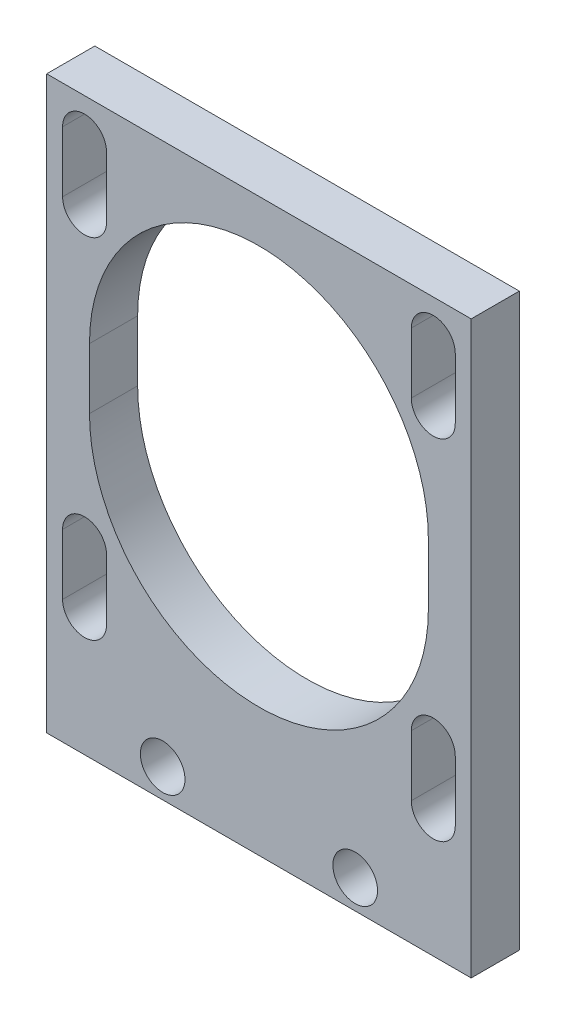
ISO-10303-21;
HEADER;
FILE_DESCRIPTION(('STEP AP214'),'2;1');
FILE_NAME('part.step','',(''),(''),'','','');
FILE_SCHEMA(('AUTOMOTIVE_DESIGN { 1 0 10303 214 1 1 1 1 }'));
ENDSEC;
DATA;
#1=APPLICATION_CONTEXT('core data for automotive mechanical design processes');
#2=APPLICATION_PROTOCOL_DEFINITION('international standard','automotive_design',2000,#1);
#3=PRODUCT_CONTEXT('',#1,'mechanical');
#4=PRODUCT('Part','Part','',(#3));
#5=PRODUCT_RELATED_PRODUCT_CATEGORY('part','',(#4));
#6=PRODUCT_DEFINITION_FORMATION('','',#4);
#7=PRODUCT_DEFINITION_CONTEXT('part definition',#1,'design');
#8=PRODUCT_DEFINITION('design','',#6,#7);
#9=PRODUCT_DEFINITION_SHAPE('','',#8);
#10=(LENGTH_UNIT() NAMED_UNIT(*) SI_UNIT(.MILLI.,.METRE.));
#11=(NAMED_UNIT(*) PLANE_ANGLE_UNIT() SI_UNIT($,.RADIAN.));
#12=(NAMED_UNIT(*) SI_UNIT($,.STERADIAN.) SOLID_ANGLE_UNIT());
#13=UNCERTAINTY_MEASURE_WITH_UNIT(LENGTH_MEASURE(1.E-05),#10,'distance_accuracy_value','');
#14=(GEOMETRIC_REPRESENTATION_CONTEXT(3) GLOBAL_UNCERTAINTY_ASSIGNED_CONTEXT((#13)) GLOBAL_UNIT_ASSIGNED_CONTEXT((#10,
#11,#12)) REPRESENTATION_CONTEXT('',''));
#15=CARTESIAN_POINT('',(0.,0.,0.));
#16=DIRECTION('',(0.,0.,1.));
#17=DIRECTION('',(1.,0.,0.));
#18=AXIS2_PLACEMENT_3D('',#15,#16,#17);
#19=CARTESIAN_POINT('',(13.99999994,-14.,3.175));
#20=DIRECTION('',(-1.,0.,0.));
#21=DIRECTION('',(0.,0.,1.));
#22=AXIS2_PLACEMENT_3D('',#19,#20,#21);
#23=PLANE('',#22);
#24=DIRECTION('',(0.,1.,0.));
#25=VECTOR('',#24,1.);
#26=CARTESIAN_POINT('',(13.99999994,-14.,3.175));
#27=LINE('',#26,#25);
#28=CARTESIAN_POINT('',(13.99999994,14.448,3.175));
#29=VERTEX_POINT('',#28);
#30=CARTESIAN_POINT('',(13.99999994,52.1,3.175));
#31=VERTEX_POINT('',#30);
#32=EDGE_CURVE('E43',#29,#31,#27,.T.);
#33=ORIENTED_EDGE('',*,*,#32,.F.);
#34=DIRECTION('',(0.,0.,-1.));
#35=VECTOR('',#34,1.);
#36=CARTESIAN_POINT('',(13.99999994,14.448,3.175));
#37=LINE('',#36,#35);
#38=CARTESIAN_POINT('',(13.99999994,14.448,0.));
#39=VERTEX_POINT('',#38);
#40=EDGE_CURVE('E198',#29,#39,#37,.T.);
#41=ORIENTED_EDGE('',*,*,#40,.T.);
#42=DIRECTION('',(0.,1.,0.));
#43=VECTOR('',#42,1.);
#44=CARTESIAN_POINT('',(13.99999994,-14.,0.));
#45=LINE('',#44,#43);
#46=CARTESIAN_POINT('',(13.99999994,52.1,0.));
#47=VERTEX_POINT('',#46);
#48=EDGE_CURVE('E233',#39,#47,#45,.T.);
#49=ORIENTED_EDGE('',*,*,#48,.T.);
#50=DIRECTION('',(0.,0.,-1.));
#51=VECTOR('',#50,1.);
#52=CARTESIAN_POINT('',(13.99999994,52.1,0.));
#53=LINE('',#52,#51);
#54=EDGE_CURVE('E216',#31,#47,#53,.T.);
#55=ORIENTED_EDGE('',*,*,#54,.F.);
#56=EDGE_LOOP('',(#33,#41,#49,#55));
#57=FACE_BOUND('',#56,.T.);
#58=ADVANCED_FACE('F35',(#57),#23,.F.);
#59=CARTESIAN_POINT('',(-13.99999994,-14.,3.175));
#60=DIRECTION('',(1.,0.,0.));
#61=DIRECTION('',(0.,0.,-1.));
#62=AXIS2_PLACEMENT_3D('',#59,#60,#61);
#63=PLANE('',#62);
#64=DIRECTION('',(0.,-1.,0.));
#65=VECTOR('',#64,1.);
#66=CARTESIAN_POINT('',(-13.99999994,-14.,0.));
#67=LINE('',#66,#65);
#68=CARTESIAN_POINT('',(-13.99999994,52.1,0.));
#69=VERTEX_POINT('',#68);
#70=CARTESIAN_POINT('',(-13.99999994,14.448,0.));
#71=VERTEX_POINT('',#70);
#72=EDGE_CURVE('E38',#69,#71,#67,.T.);
#73=ORIENTED_EDGE('',*,*,#72,.T.);
#74=DIRECTION('',(0.,0.,-1.));
#75=VECTOR('',#74,1.);
#76=CARTESIAN_POINT('',(-13.99999994,14.448,3.175));
#77=LINE('',#76,#75);
#78=CARTESIAN_POINT('',(-13.99999994,14.448,3.175));
#79=VERTEX_POINT('',#78);
#80=EDGE_CURVE('E51',#79,#71,#77,.T.);
#81=ORIENTED_EDGE('',*,*,#80,.F.);
#82=DIRECTION('',(0.,-1.,0.));
#83=VECTOR('',#82,1.);
#84=CARTESIAN_POINT('',(-13.99999994,-14.,3.175));
#85=LINE('',#84,#83);
#86=CARTESIAN_POINT('',(-13.99999994,52.1,3.175));
#87=VERTEX_POINT('',#86);
#88=EDGE_CURVE('E11',#87,#79,#85,.T.);
#89=ORIENTED_EDGE('',*,*,#88,.F.);
#90=DIRECTION('',(0.,0.,1.));
#91=VECTOR('',#90,1.);
#92=CARTESIAN_POINT('',(-13.99999994,52.1,0.));
#93=LINE('',#92,#91);
#94=EDGE_CURVE('E217',#69,#87,#93,.T.);
#95=ORIENTED_EDGE('',*,*,#94,.F.);
#96=EDGE_LOOP('',(#73,#81,#89,#95));
#97=FACE_BOUND('',#96,.T.);
#98=ADVANCED_FACE('F205',(#97),#63,.F.);
#99=CARTESIAN_POINT('',(13.99999994,14.,3.175));
#100=DIRECTION('',(0.,0.,-1.));
#101=DIRECTION('',(-1.,0.,0.));
#102=AXIS2_PLACEMENT_3D('',#99,#100,#101);
#103=PLANE('',#102);
#104=CARTESIAN_POINT('',(6.34999999999997,16.3457722435057,3.175));
#105=DIRECTION('',(0.,0.,-1.));
#106=DIRECTION('',(-1.,0.,0.));
#107=AXIS2_PLACEMENT_3D('',#104,#105,#106);
#108=CIRCLE('',#107,1.4732);
#109=CARTESIAN_POINT('',(4.87679999999998,16.3457722435057,3.175));
#110=VERTEX_POINT('',#109);
#111=EDGE_CURVE('E245',#110,#110,#108,.T.);
#112=ORIENTED_EDGE('',*,*,#111,.T.);
#113=EDGE_LOOP('',(#112));
#114=FACE_BOUND('',#113,.T.);
#115=CARTESIAN_POINT('',(-6.34999999999993,16.3457722435058,3.175));
#116=DIRECTION('',(0.,0.,-1.));
#117=DIRECTION('',(-1.,0.,0.));
#118=AXIS2_PLACEMENT_3D('',#115,#116,#117);
#119=CIRCLE('',#118,1.4732);
#120=CARTESIAN_POINT('',(-7.82319999999993,16.3457722435058,3.175));
#121=VERTEX_POINT('',#120);
#122=EDGE_CURVE('E251',#121,#121,#119,.T.);
#123=ORIENTED_EDGE('',*,*,#122,.T.);
#124=EDGE_LOOP('',(#123));
#125=FACE_BOUND('',#124,.T.);
#126=DIRECTION('',(0.,-1.,0.));
#127=VECTOR('',#126,1.);
#128=CARTESIAN_POINT('',(11.176,34.1,3.175));
#129=LINE('',#128,#127);
#130=CARTESIAN_POINT('',(11.176,38.1,3.175));
#131=VERTEX_POINT('',#130);
#132=CARTESIAN_POINT('',(11.176,34.1,3.175));
#133=VERTEX_POINT('',#132);
#134=EDGE_CURVE('E263',#131,#133,#129,.T.);
#135=ORIENTED_EDGE('',*,*,#134,.T.);
#136=CARTESIAN_POINT('',(0.,34.1,3.175));
#137=DIRECTION('',(0.,0.,-1.));
#138=DIRECTION('',(-1.,0.,0.));
#139=AXIS2_PLACEMENT_3D('',#136,#137,#138);
#140=CIRCLE('',#139,11.176);
#141=CARTESIAN_POINT('',(-11.176,34.1,3.175));
#142=VERTEX_POINT('',#141);
#143=EDGE_CURVE('E255',#133,#142,#140,.T.);
#144=ORIENTED_EDGE('',*,*,#143,.T.);
#145=DIRECTION('',(0.,1.,0.));
#146=VECTOR('',#145,1.);
#147=CARTESIAN_POINT('',(-11.176,34.1,3.175));
#148=LINE('',#147,#146);
#149=CARTESIAN_POINT('',(-11.176,38.1,3.175));
#150=VERTEX_POINT('',#149);
#151=EDGE_CURVE('E258',#142,#150,#148,.T.);
#152=ORIENTED_EDGE('',*,*,#151,.T.);
#153=CARTESIAN_POINT('',(0.,38.1,3.175));
#154=DIRECTION('',(0.,0.,-1.));
#155=DIRECTION('',(-1.,0.,0.));
#156=AXIS2_PLACEMENT_3D('',#153,#154,#155);
#157=CIRCLE('',#156,11.176);
#158=EDGE_CURVE('E59',#150,#131,#157,.T.);
#159=ORIENTED_EDGE('',*,*,#158,.T.);
#160=EDGE_LOOP('',(#135,#144,#152,#159));
#161=FACE_BOUND('',#160,.T.);
#162=DIRECTION('',(0.,-1.,0.));
#163=VECTOR('',#162,1.);
#164=CARTESIAN_POINT('',(-10.05000006,22.6,3.175));
#165=LINE('',#164,#163);
#166=CARTESIAN_POINT('',(-10.05000006,26.6,3.175));
#167=VERTEX_POINT('',#166);
#168=CARTESIAN_POINT('',(-10.05000006,22.6,3.175));
#169=VERTEX_POINT('',#168);
#170=EDGE_CURVE('E295',#167,#169,#165,.T.);
#171=ORIENTED_EDGE('',*,*,#170,.T.);
#172=CARTESIAN_POINT('',(-11.50000006,22.6,3.175));
#173=DIRECTION('',(0.,0.,-1.));
#174=DIRECTION('',(-1.,0.,0.));
#175=AXIS2_PLACEMENT_3D('',#172,#173,#174);
#176=CIRCLE('',#175,1.45);
#177=CARTESIAN_POINT('',(-12.95000006,22.6,3.175));
#178=VERTEX_POINT('',#177);
#179=EDGE_CURVE('E285',#169,#178,#176,.T.);
#180=ORIENTED_EDGE('',*,*,#179,.T.);
#181=DIRECTION('',(0.,1.,0.));
#182=VECTOR('',#181,1.);
#183=CARTESIAN_POINT('',(-12.95000006,22.6,3.175));
#184=LINE('',#183,#182);
#185=CARTESIAN_POINT('',(-12.95000006,26.6,3.175));
#186=VERTEX_POINT('',#185);
#187=EDGE_CURVE('E288',#178,#186,#184,.T.);
#188=ORIENTED_EDGE('',*,*,#187,.T.);
#189=CARTESIAN_POINT('',(-11.5000000600002,26.6,3.175));
#190=DIRECTION('',(0.,0.,-1.));
#191=DIRECTION('',(-1.,0.,0.));
#192=AXIS2_PLACEMENT_3D('',#189,#190,#191);
#193=CIRCLE('',#192,1.45);
#194=EDGE_CURVE('E292',#186,#167,#193,.T.);
#195=ORIENTED_EDGE('',*,*,#194,.T.);
#196=EDGE_LOOP('',(#171,#180,#188,#195));
#197=FACE_BOUND('',#196,.T.);
#198=DIRECTION('',(0.,-1.,0.));
#199=VECTOR('',#198,1.);
#200=CARTESIAN_POINT('',(12.94999994,22.6,3.175));
#201=LINE('',#200,#199);
#202=CARTESIAN_POINT('',(12.94999994,26.6,3.175));
#203=VERTEX_POINT('',#202);
#204=CARTESIAN_POINT('',(12.94999994,22.6,3.175));
#205=VERTEX_POINT('',#204);
#206=EDGE_CURVE('E327',#203,#205,#201,.T.);
#207=ORIENTED_EDGE('',*,*,#206,.T.);
#208=CARTESIAN_POINT('',(11.49999994,22.6,3.175));
#209=DIRECTION('',(0.,0.,-1.));
#210=DIRECTION('',(-1.,0.,0.));
#211=AXIS2_PLACEMENT_3D('',#208,#209,#210);
#212=CIRCLE('',#211,1.45);
#213=CARTESIAN_POINT('',(10.04999994,22.6,3.175));
#214=VERTEX_POINT('',#213);
#215=EDGE_CURVE('E317',#205,#214,#212,.T.);
#216=ORIENTED_EDGE('',*,*,#215,.T.);
#217=DIRECTION('',(0.,1.,0.));
#218=VECTOR('',#217,1.);
#219=CARTESIAN_POINT('',(10.04999994,22.6,3.175));
#220=LINE('',#219,#218);
#221=CARTESIAN_POINT('',(10.04999994,26.6,3.175));
#222=VERTEX_POINT('',#221);
#223=EDGE_CURVE('E320',#214,#222,#220,.T.);
#224=ORIENTED_EDGE('',*,*,#223,.T.);
#225=CARTESIAN_POINT('',(11.4999999399998,26.6,3.175));
#226=DIRECTION('',(0.,0.,-1.));
#227=DIRECTION('',(-1.,0.,0.));
#228=AXIS2_PLACEMENT_3D('',#225,#226,#227);
#229=CIRCLE('',#228,1.45);
#230=EDGE_CURVE('E324',#222,#203,#229,.T.);
#231=ORIENTED_EDGE('',*,*,#230,.T.);
#232=EDGE_LOOP('',(#207,#216,#224,#231));
#233=FACE_BOUND('',#232,.T.);
#234=DIRECTION('',(0.,-1.,0.));
#235=VECTOR('',#234,1.);
#236=CARTESIAN_POINT('',(-10.05000006,45.6,3.175));
#237=LINE('',#236,#235);
#238=CARTESIAN_POINT('',(-10.05000006,49.6,3.175));
#239=VERTEX_POINT('',#238);
#240=CARTESIAN_POINT('',(-10.05000006,45.6,3.175));
#241=VERTEX_POINT('',#240);
#242=EDGE_CURVE('E359',#239,#241,#237,.T.);
#243=ORIENTED_EDGE('',*,*,#242,.T.);
#244=CARTESIAN_POINT('',(-11.5000000599998,45.6,3.175));
#245=DIRECTION('',(0.,0.,-1.));
#246=DIRECTION('',(-1.,0.,0.));
#247=AXIS2_PLACEMENT_3D('',#244,#245,#246);
#248=CIRCLE('',#247,1.45);
#249=CARTESIAN_POINT('',(-12.95000006,45.6,3.175));
#250=VERTEX_POINT('',#249);
#251=EDGE_CURVE('E349',#241,#250,#248,.T.);
#252=ORIENTED_EDGE('',*,*,#251,.T.);
#253=DIRECTION('',(0.,1.,0.));
#254=VECTOR('',#253,1.);
#255=CARTESIAN_POINT('',(-12.95000006,45.6,3.175));
#256=LINE('',#255,#254);
#257=CARTESIAN_POINT('',(-12.95000006,49.6,3.175));
#258=VERTEX_POINT('',#257);
#259=EDGE_CURVE('E352',#250,#258,#256,.T.);
#260=ORIENTED_EDGE('',*,*,#259,.T.);
#261=CARTESIAN_POINT('',(-11.50000006,49.6,3.175));
#262=DIRECTION('',(0.,0.,-1.));
#263=DIRECTION('',(-1.,0.,0.));
#264=AXIS2_PLACEMENT_3D('',#261,#262,#263);
#265=CIRCLE('',#264,1.45);
#266=EDGE_CURVE('E356',#258,#239,#265,.T.);
#267=ORIENTED_EDGE('',*,*,#266,.T.);
#268=EDGE_LOOP('',(#243,#252,#260,#267));
#269=FACE_BOUND('',#268,.T.);
#270=DIRECTION('',(0.,-1.,0.));
#271=VECTOR('',#270,1.);
#272=CARTESIAN_POINT('',(12.94999994,45.6,3.175));
#273=LINE('',#272,#271);
#274=CARTESIAN_POINT('',(12.94999994,49.6,3.175));
#275=VERTEX_POINT('',#274);
#276=CARTESIAN_POINT('',(12.94999994,45.6,3.175));
#277=VERTEX_POINT('',#276);
#278=EDGE_CURVE('E391',#275,#277,#273,.T.);
#279=ORIENTED_EDGE('',*,*,#278,.T.);
#280=CARTESIAN_POINT('',(11.49999994,45.6,3.175));
#281=DIRECTION('',(0.,0.,-1.));
#282=DIRECTION('',(-1.,0.,0.));
#283=AXIS2_PLACEMENT_3D('',#280,#281,#282);
#284=CIRCLE('',#283,1.45);
#285=CARTESIAN_POINT('',(10.04999994,45.6,3.175));
#286=VERTEX_POINT('',#285);
#287=EDGE_CURVE('E381',#277,#286,#284,.T.);
#288=ORIENTED_EDGE('',*,*,#287,.T.);
#289=DIRECTION('',(0.,1.,0.));
#290=VECTOR('',#289,1.);
#291=CARTESIAN_POINT('',(10.04999994,45.6,3.175));
#292=LINE('',#291,#290);
#293=CARTESIAN_POINT('',(10.04999994,49.6,3.175));
#294=VERTEX_POINT('',#293);
#295=EDGE_CURVE('E384',#286,#294,#292,.T.);
#296=ORIENTED_EDGE('',*,*,#295,.T.);
#297=CARTESIAN_POINT('',(11.49999994,49.6,3.175));
#298=DIRECTION('',(0.,0.,-1.));
#299=DIRECTION('',(-1.,0.,0.));
#300=AXIS2_PLACEMENT_3D('',#297,#298,#299);
#301=CIRCLE('',#300,1.45);
#302=EDGE_CURVE('E388',#294,#275,#301,.T.);
#303=ORIENTED_EDGE('',*,*,#302,.T.);
#304=EDGE_LOOP('',(#279,#288,#296,#303));
#305=FACE_BOUND('',#304,.T.);
#306=ORIENTED_EDGE('',*,*,#88,.T.);
#307=DIRECTION('',(1.,0.,0.));
#308=VECTOR('',#307,1.);
#309=CARTESIAN_POINT('',(13.99999994,14.448,3.175));
#310=LINE('',#309,#308);
#311=EDGE_CURVE('E195',#79,#29,#310,.T.);
#312=ORIENTED_EDGE('',*,*,#311,.T.);
#313=ORIENTED_EDGE('',*,*,#32,.T.);
#314=DIRECTION('',(1.,0.,0.));
#315=VECTOR('',#314,1.);
#316=CARTESIAN_POINT('',(-13.99999994,52.1,3.175));
#317=LINE('',#316,#315);
#318=EDGE_CURVE('E211',#87,#31,#317,.T.);
#319=ORIENTED_EDGE('',*,*,#318,.F.);
#320=EDGE_LOOP('',(#306,#312,#313,#319));
#321=FACE_BOUND('',#320,.T.);
#322=ADVANCED_FACE('F209',(#114,#125,#161,#197,#233,#269,#305,#321),#103,.F.);
#323=CARTESIAN_POINT('',(13.99999994,14.,0.));
#324=DIRECTION('',(0.,0.,-1.));
#325=DIRECTION('',(-1.,0.,0.));
#326=AXIS2_PLACEMENT_3D('',#323,#324,#325);
#327=PLANE('',#326);
#328=DIRECTION('',(1.,0.,0.));
#329=VECTOR('',#328,1.);
#330=CARTESIAN_POINT('',(13.99999994,14.448,0.));
#331=LINE('',#330,#329);
#332=EDGE_CURVE('E201',#71,#39,#331,.T.);
#333=ORIENTED_EDGE('',*,*,#332,.F.);
#334=ORIENTED_EDGE('',*,*,#72,.F.);
#335=DIRECTION('',(-1.,0.,0.));
#336=VECTOR('',#335,1.);
#337=CARTESIAN_POINT('',(-13.99999994,52.1,0.));
#338=LINE('',#337,#336);
#339=EDGE_CURVE('E222',#47,#69,#338,.T.);
#340=ORIENTED_EDGE('',*,*,#339,.F.);
#341=ORIENTED_EDGE('',*,*,#48,.F.);
#342=EDGE_LOOP('',(#333,#334,#340,#341));
#343=FACE_BOUND('',#342,.T.);
#344=CARTESIAN_POINT('',(6.34999999999997,16.3457722435057,0.));
#345=DIRECTION('',(0.,0.,-1.));
#346=DIRECTION('',(-1.,0.,0.));
#347=AXIS2_PLACEMENT_3D('',#344,#345,#346);
#348=CIRCLE('',#347,1.4732);
#349=CARTESIAN_POINT('',(4.87679999999998,16.3457722435057,0.));
#350=VERTEX_POINT('',#349);
#351=EDGE_CURVE('E241',#350,#350,#348,.T.);
#352=ORIENTED_EDGE('',*,*,#351,.F.);
#353=EDGE_LOOP('',(#352));
#354=FACE_BOUND('',#353,.T.);
#355=CARTESIAN_POINT('',(-6.34999999999993,16.3457722435058,0.));
#356=DIRECTION('',(0.,0.,-1.));
#357=DIRECTION('',(-1.,0.,0.));
#358=AXIS2_PLACEMENT_3D('',#355,#356,#357);
#359=CIRCLE('',#358,1.4732);
#360=CARTESIAN_POINT('',(-7.82319999999993,16.3457722435058,0.));
#361=VERTEX_POINT('',#360);
#362=EDGE_CURVE('E248',#361,#361,#359,.T.);
#363=ORIENTED_EDGE('',*,*,#362,.F.);
#364=EDGE_LOOP('',(#363));
#365=FACE_BOUND('',#364,.T.);
#366=CARTESIAN_POINT('',(0.,34.1,0.));
#367=DIRECTION('',(0.,0.,-1.));
#368=DIRECTION('',(-1.,0.,0.));
#369=AXIS2_PLACEMENT_3D('',#366,#367,#368);
#370=CIRCLE('',#369,11.176);
#371=CARTESIAN_POINT('',(11.176,34.1,0.));
#372=VERTEX_POINT('',#371);
#373=CARTESIAN_POINT('',(-11.176,34.1,0.));
#374=VERTEX_POINT('',#373);
#375=EDGE_CURVE('E254',#372,#374,#370,.T.);
#376=ORIENTED_EDGE('',*,*,#375,.F.);
#377=DIRECTION('',(0.,-1.,0.));
#378=VECTOR('',#377,1.);
#379=CARTESIAN_POINT('',(11.176,34.1,0.));
#380=LINE('',#379,#378);
#381=CARTESIAN_POINT('',(11.176,38.1,0.));
#382=VERTEX_POINT('',#381);
#383=EDGE_CURVE('E259',#382,#372,#380,.T.);
#384=ORIENTED_EDGE('',*,*,#383,.F.);
#385=CARTESIAN_POINT('',(0.,38.1,0.));
#386=DIRECTION('',(0.,0.,-1.));
#387=DIRECTION('',(-1.,0.,0.));
#388=AXIS2_PLACEMENT_3D('',#385,#386,#387);
#389=CIRCLE('',#388,11.176);
#390=CARTESIAN_POINT('',(-11.176,38.1,0.));
#391=VERTEX_POINT('',#390);
#392=EDGE_CURVE('E271',#391,#382,#389,.T.);
#393=ORIENTED_EDGE('',*,*,#392,.F.);
#394=DIRECTION('',(0.,1.,0.));
#395=VECTOR('',#394,1.);
#396=CARTESIAN_POINT('',(-11.176,34.1,0.));
#397=LINE('',#396,#395);
#398=EDGE_CURVE('E268',#374,#391,#397,.T.);
#399=ORIENTED_EDGE('',*,*,#398,.F.);
#400=EDGE_LOOP('',(#376,#384,#393,#399));
#401=FACE_BOUND('',#400,.T.);
#402=CARTESIAN_POINT('',(-11.50000006,22.6,0.));
#403=DIRECTION('',(0.,0.,-1.));
#404=DIRECTION('',(-1.,0.,0.));
#405=AXIS2_PLACEMENT_3D('',#402,#403,#404);
#406=CIRCLE('',#405,1.45);
#407=CARTESIAN_POINT('',(-10.05000006,22.6,0.));
#408=VERTEX_POINT('',#407);
#409=CARTESIAN_POINT('',(-12.95000006,22.6,0.));
#410=VERTEX_POINT('',#409);
#411=EDGE_CURVE('E278',#408,#410,#406,.T.);
#412=ORIENTED_EDGE('',*,*,#411,.F.);
#413=DIRECTION('',(0.,-1.,0.));
#414=VECTOR('',#413,1.);
#415=CARTESIAN_POINT('',(-10.05000006,22.6,0.));
#416=LINE('',#415,#414);
#417=CARTESIAN_POINT('',(-10.05000006,26.6,0.));
#418=VERTEX_POINT('',#417);
#419=EDGE_CURVE('E289',#418,#408,#416,.T.);
#420=ORIENTED_EDGE('',*,*,#419,.F.);
#421=CARTESIAN_POINT('',(-11.5000000600002,26.6,0.));
#422=DIRECTION('',(0.,0.,-1.));
#423=DIRECTION('',(-1.,0.,0.));
#424=AXIS2_PLACEMENT_3D('',#421,#422,#423);
#425=CIRCLE('',#424,1.45);
#426=CARTESIAN_POINT('',(-12.9500000600002,26.6,0.));
#427=VERTEX_POINT('',#426);
#428=EDGE_CURVE('E303',#427,#418,#425,.T.);
#429=ORIENTED_EDGE('',*,*,#428,.F.);
#430=DIRECTION('',(0.,1.,0.));
#431=VECTOR('',#430,1.);
#432=CARTESIAN_POINT('',(-12.95000006,22.6,0.));
#433=LINE('',#432,#431);
#434=EDGE_CURVE('E300',#410,#427,#433,.T.);
#435=ORIENTED_EDGE('',*,*,#434,.F.);
#436=EDGE_LOOP('',(#412,#420,#429,#435));
#437=FACE_BOUND('',#436,.T.);
#438=CARTESIAN_POINT('',(11.49999994,22.6,0.));
#439=DIRECTION('',(0.,0.,-1.));
#440=DIRECTION('',(-1.,0.,0.));
#441=AXIS2_PLACEMENT_3D('',#438,#439,#440);
#442=CIRCLE('',#441,1.45);
#443=CARTESIAN_POINT('',(12.94999994,22.6,0.));
#444=VERTEX_POINT('',#443);
#445=CARTESIAN_POINT('',(10.04999994,22.6,0.));
#446=VERTEX_POINT('',#445);
#447=EDGE_CURVE('E310',#444,#446,#442,.T.);
#448=ORIENTED_EDGE('',*,*,#447,.F.);
#449=DIRECTION('',(0.,-1.,0.));
#450=VECTOR('',#449,1.);
#451=CARTESIAN_POINT('',(12.94999994,22.6,0.));
#452=LINE('',#451,#450);
#453=CARTESIAN_POINT('',(12.94999994,26.6,0.));
#454=VERTEX_POINT('',#453);
#455=EDGE_CURVE('E321',#454,#444,#452,.T.);
#456=ORIENTED_EDGE('',*,*,#455,.F.);
#457=CARTESIAN_POINT('',(11.4999999399998,26.6,0.));
#458=DIRECTION('',(0.,0.,-1.));
#459=DIRECTION('',(-1.,0.,0.));
#460=AXIS2_PLACEMENT_3D('',#457,#458,#459);
#461=CIRCLE('',#460,1.45);
#462=CARTESIAN_POINT('',(10.0499999399998,26.6,0.));
#463=VERTEX_POINT('',#462);
#464=EDGE_CURVE('E335',#463,#454,#461,.T.);
#465=ORIENTED_EDGE('',*,*,#464,.F.);
#466=DIRECTION('',(0.,1.,0.));
#467=VECTOR('',#466,1.);
#468=CARTESIAN_POINT('',(10.04999994,22.6,0.));
#469=LINE('',#468,#467);
#470=EDGE_CURVE('E332',#446,#463,#469,.T.);
#471=ORIENTED_EDGE('',*,*,#470,.F.);
#472=EDGE_LOOP('',(#448,#456,#465,#471));
#473=FACE_BOUND('',#472,.T.);
#474=CARTESIAN_POINT('',(-11.5000000599998,45.6,0.));
#475=DIRECTION('',(0.,0.,-1.));
#476=DIRECTION('',(-1.,0.,0.));
#477=AXIS2_PLACEMENT_3D('',#474,#475,#476);
#478=CIRCLE('',#477,1.45);
#479=CARTESIAN_POINT('',(-10.05000006,45.6,0.));
#480=VERTEX_POINT('',#479);
#481=CARTESIAN_POINT('',(-12.95000006,45.6,0.));
#482=VERTEX_POINT('',#481);
#483=EDGE_CURVE('E342',#480,#482,#478,.T.);
#484=ORIENTED_EDGE('',*,*,#483,.F.);
#485=DIRECTION('',(0.,-1.,0.));
#486=VECTOR('',#485,1.);
#487=CARTESIAN_POINT('',(-10.05000006,45.6,0.));
#488=LINE('',#487,#486);
#489=CARTESIAN_POINT('',(-10.05000006,49.6,0.));
#490=VERTEX_POINT('',#489);
#491=EDGE_CURVE('E353',#490,#480,#488,.T.);
#492=ORIENTED_EDGE('',*,*,#491,.F.);
#493=CARTESIAN_POINT('',(-11.50000006,49.6,0.));
#494=DIRECTION('',(0.,0.,-1.));
#495=DIRECTION('',(-1.,0.,0.));
#496=AXIS2_PLACEMENT_3D('',#493,#494,#495);
#497=CIRCLE('',#496,1.45);
#498=CARTESIAN_POINT('',(-12.95000006,49.6,0.));
#499=VERTEX_POINT('',#498);
#500=EDGE_CURVE('E367',#499,#490,#497,.T.);
#501=ORIENTED_EDGE('',*,*,#500,.F.);
#502=DIRECTION('',(0.,1.,0.));
#503=VECTOR('',#502,1.);
#504=CARTESIAN_POINT('',(-12.95000006,45.6,0.));
#505=LINE('',#504,#503);
#506=EDGE_CURVE('E364',#482,#499,#505,.T.);
#507=ORIENTED_EDGE('',*,*,#506,.F.);
#508=EDGE_LOOP('',(#484,#492,#501,#507));
#509=FACE_BOUND('',#508,.T.);
#510=CARTESIAN_POINT('',(11.49999994,45.6,0.));
#511=DIRECTION('',(0.,0.,-1.));
#512=DIRECTION('',(-1.,0.,0.));
#513=AXIS2_PLACEMENT_3D('',#510,#511,#512);
#514=CIRCLE('',#513,1.45);
#515=CARTESIAN_POINT('',(12.94999994,45.6,0.));
#516=VERTEX_POINT('',#515);
#517=CARTESIAN_POINT('',(10.04999994,45.6,0.));
#518=VERTEX_POINT('',#517);
#519=EDGE_CURVE('E374',#516,#518,#514,.T.);
#520=ORIENTED_EDGE('',*,*,#519,.F.);
#521=DIRECTION('',(0.,-1.,0.));
#522=VECTOR('',#521,1.);
#523=CARTESIAN_POINT('',(12.94999994,45.6,0.));
#524=LINE('',#523,#522);
#525=CARTESIAN_POINT('',(12.94999994,49.6,0.));
#526=VERTEX_POINT('',#525);
#527=EDGE_CURVE('E385',#526,#516,#524,.T.);
#528=ORIENTED_EDGE('',*,*,#527,.F.);
#529=CARTESIAN_POINT('',(11.49999994,49.6,0.));
#530=DIRECTION('',(0.,0.,-1.));
#531=DIRECTION('',(-1.,0.,0.));
#532=AXIS2_PLACEMENT_3D('',#529,#530,#531);
#533=CIRCLE('',#532,1.45);
#534=CARTESIAN_POINT('',(10.04999994,49.6,0.));
#535=VERTEX_POINT('',#534);
#536=EDGE_CURVE('E398',#535,#526,#533,.T.);
#537=ORIENTED_EDGE('',*,*,#536,.F.);
#538=DIRECTION('',(0.,1.,0.));
#539=VECTOR('',#538,1.);
#540=CARTESIAN_POINT('',(10.04999994,45.6,0.));
#541=LINE('',#540,#539);
#542=EDGE_CURVE('E395',#518,#535,#541,.T.);
#543=ORIENTED_EDGE('',*,*,#542,.F.);
#544=EDGE_LOOP('',(#520,#528,#537,#543));
#545=FACE_BOUND('',#544,.T.);
#546=ADVANCED_FACE('F237',(#343,#354,#365,#401,#437,#473,#509,#545),#327,.T.);
#547=CARTESIAN_POINT('',(-13.99999994,52.1,3.175));
#548=DIRECTION('',(0.,1.,0.));
#549=DIRECTION('',(0.,0.,1.));
#550=AXIS2_PLACEMENT_3D('',#547,#548,#549);
#551=PLANE('',#550);
#552=ORIENTED_EDGE('',*,*,#94,.T.);
#553=ORIENTED_EDGE('',*,*,#318,.T.);
#554=ORIENTED_EDGE('',*,*,#54,.T.);
#555=ORIENTED_EDGE('',*,*,#339,.T.);
#556=EDGE_LOOP('',(#552,#553,#554,#555));
#557=FACE_BOUND('',#556,.T.);
#558=ADVANCED_FACE('F220',(#557),#551,.T.);
#559=CARTESIAN_POINT('',(11.49999994,45.6,3.175));
#560=DIRECTION('',(0.,0.,-1.));
#561=DIRECTION('',(-1.,0.,0.));
#562=AXIS2_PLACEMENT_3D('',#559,#560,#561);
#563=CYLINDRICAL_SURFACE('',#562,1.45);
#564=ORIENTED_EDGE('',*,*,#519,.T.);
#565=DIRECTION('',(0.,0.,-1.));
#566=VECTOR('',#565,1.);
#567=CARTESIAN_POINT('',(10.04999994,45.6,3.175));
#568=LINE('',#567,#566);
#569=EDGE_CURVE('E228',#286,#518,#568,.T.);
#570=ORIENTED_EDGE('',*,*,#569,.F.);
#571=ORIENTED_EDGE('',*,*,#287,.F.);
#572=DIRECTION('',(0.,0.,-1.));
#573=VECTOR('',#572,1.);
#574=CARTESIAN_POINT('',(12.94999994,45.6,3.175));
#575=LINE('',#574,#573);
#576=EDGE_CURVE('E223',#277,#516,#575,.T.);
#577=ORIENTED_EDGE('',*,*,#576,.T.);
#578=EDGE_LOOP('',(#564,#570,#571,#577));
#579=FACE_BOUND('',#578,.T.);
#580=ADVANCED_FACE('F422',(#579),#563,.F.);
#581=CARTESIAN_POINT('',(12.94999994,45.6,3.175));
#582=DIRECTION('',(1.,0.,0.));
#583=DIRECTION('',(0.,0.,-1.));
#584=AXIS2_PLACEMENT_3D('',#581,#582,#583);
#585=PLANE('',#584);
#586=ORIENTED_EDGE('',*,*,#527,.T.);
#587=ORIENTED_EDGE('',*,*,#576,.F.);
#588=ORIENTED_EDGE('',*,*,#278,.F.);
#589=DIRECTION('',(0.,0.,-1.));
#590=VECTOR('',#589,1.);
#591=CARTESIAN_POINT('',(12.94999994,49.6,3.175));
#592=LINE('',#591,#590);
#593=EDGE_CURVE('E225',#275,#526,#592,.T.);
#594=ORIENTED_EDGE('',*,*,#593,.T.);
#595=EDGE_LOOP('',(#586,#587,#588,#594));
#596=FACE_BOUND('',#595,.T.);
#597=ADVANCED_FACE('F420',(#596),#585,.F.);
#598=CARTESIAN_POINT('',(11.49999994,49.6,3.175));
#599=DIRECTION('',(0.,0.,-1.));
#600=DIRECTION('',(-1.,0.,0.));
#601=AXIS2_PLACEMENT_3D('',#598,#599,#600);
#602=CYLINDRICAL_SURFACE('',#601,1.45);
#603=ORIENTED_EDGE('',*,*,#536,.T.);
#604=ORIENTED_EDGE('',*,*,#593,.F.);
#605=ORIENTED_EDGE('',*,*,#302,.F.);
#606=DIRECTION('',(0.,0.,-1.));
#607=VECTOR('',#606,1.);
#608=CARTESIAN_POINT('',(10.04999994,49.6,3.175));
#609=LINE('',#608,#607);
#610=EDGE_CURVE('E403',#294,#535,#609,.T.);
#611=ORIENTED_EDGE('',*,*,#610,.T.);
#612=EDGE_LOOP('',(#603,#604,#605,#611));
#613=FACE_BOUND('',#612,.T.);
#614=ADVANCED_FACE('F417',(#613),#602,.F.);
#615=CARTESIAN_POINT('',(10.04999994,45.6,3.175));
#616=DIRECTION('',(-1.,0.,0.));
#617=DIRECTION('',(0.,0.,1.));
#618=AXIS2_PLACEMENT_3D('',#615,#616,#617);
#619=PLANE('',#618);
#620=ORIENTED_EDGE('',*,*,#542,.T.);
#621=ORIENTED_EDGE('',*,*,#610,.F.);
#622=ORIENTED_EDGE('',*,*,#295,.F.);
#623=ORIENTED_EDGE('',*,*,#569,.T.);
#624=EDGE_LOOP('',(#620,#621,#622,#623));
#625=FACE_BOUND('',#624,.T.);
#626=ADVANCED_FACE('F410',(#625),#619,.F.);
#627=CARTESIAN_POINT('',(-11.5000000599998,45.6,3.175));
#628=DIRECTION('',(0.,0.,-1.));
#629=DIRECTION('',(-1.,0.,0.));
#630=AXIS2_PLACEMENT_3D('',#627,#628,#629);
#631=CYLINDRICAL_SURFACE('',#630,1.45);
#632=ORIENTED_EDGE('',*,*,#483,.T.);
#633=DIRECTION('',(0.,0.,-1.));
#634=VECTOR('',#633,1.);
#635=CARTESIAN_POINT('',(-12.95000006,45.6,3.175));
#636=LINE('',#635,#634);
#637=EDGE_CURVE('E362',#250,#482,#636,.T.);
#638=ORIENTED_EDGE('',*,*,#637,.F.);
#639=ORIENTED_EDGE('',*,*,#251,.F.);
#640=DIRECTION('',(0.,0.,-1.));
#641=VECTOR('',#640,1.);
#642=CARTESIAN_POINT('',(-10.05000006,45.6,3.175));
#643=LINE('',#642,#641);
#644=EDGE_CURVE('E372',#241,#480,#643,.T.);
#645=ORIENTED_EDGE('',*,*,#644,.T.);
#646=EDGE_LOOP('',(#632,#638,#639,#645));
#647=FACE_BOUND('',#646,.T.);
#648=ADVANCED_FACE('F479',(#647),#631,.F.);
#649=CARTESIAN_POINT('',(-10.05000006,45.6,3.175));
#650=DIRECTION('',(1.,0.,0.));
#651=DIRECTION('',(0.,0.,-1.));
#652=AXIS2_PLACEMENT_3D('',#649,#650,#651);
#653=PLANE('',#652);
#654=ORIENTED_EDGE('',*,*,#491,.T.);
#655=ORIENTED_EDGE('',*,*,#644,.F.);
#656=ORIENTED_EDGE('',*,*,#242,.F.);
#657=DIRECTION('',(0.,0.,-1.));
#658=VECTOR('',#657,1.);
#659=CARTESIAN_POINT('',(-10.05000006,49.6,3.175));
#660=LINE('',#659,#658);
#661=EDGE_CURVE('E375',#239,#490,#660,.T.);
#662=ORIENTED_EDGE('',*,*,#661,.T.);
#663=EDGE_LOOP('',(#654,#655,#656,#662));
#664=FACE_BOUND('',#663,.T.);
#665=ADVANCED_FACE('F487',(#664),#653,.F.);
#666=CARTESIAN_POINT('',(-11.50000006,49.6,3.175));
#667=DIRECTION('',(0.,0.,-1.));
#668=DIRECTION('',(-1.,0.,0.));
#669=AXIS2_PLACEMENT_3D('',#666,#667,#668);
#670=CYLINDRICAL_SURFACE('',#669,1.45);
#671=ORIENTED_EDGE('',*,*,#500,.T.);
#672=ORIENTED_EDGE('',*,*,#661,.F.);
#673=ORIENTED_EDGE('',*,*,#266,.F.);
#674=DIRECTION('',(0.,0.,-1.));
#675=VECTOR('',#674,1.);
#676=CARTESIAN_POINT('',(-12.95000006,49.6,3.175));
#677=LINE('',#676,#675);
#678=EDGE_CURVE('E377',#258,#499,#677,.T.);
#679=ORIENTED_EDGE('',*,*,#678,.T.);
#680=EDGE_LOOP('',(#671,#672,#673,#679));
#681=FACE_BOUND('',#680,.T.);
#682=ADVANCED_FACE('F497',(#681),#670,.F.);
#683=CARTESIAN_POINT('',(-12.95000006,45.6,3.175));
#684=DIRECTION('',(-1.,0.,0.));
#685=DIRECTION('',(0.,0.,1.));
#686=AXIS2_PLACEMENT_3D('',#683,#684,#685);
#687=PLANE('',#686);
#688=ORIENTED_EDGE('',*,*,#506,.T.);
#689=ORIENTED_EDGE('',*,*,#678,.F.);
#690=ORIENTED_EDGE('',*,*,#259,.F.);
#691=ORIENTED_EDGE('',*,*,#637,.T.);
#692=EDGE_LOOP('',(#688,#689,#690,#691));
#693=FACE_BOUND('',#692,.T.);
#694=ADVANCED_FACE('F507',(#693),#687,.F.);
#695=CARTESIAN_POINT('',(11.49999994,22.6,3.175));
#696=DIRECTION('',(0.,0.,-1.));
#697=DIRECTION('',(-1.,0.,0.));
#698=AXIS2_PLACEMENT_3D('',#695,#696,#697);
#699=CYLINDRICAL_SURFACE('',#698,1.45);
#700=ORIENTED_EDGE('',*,*,#447,.T.);
#701=DIRECTION('',(0.,0.,-1.));
#702=VECTOR('',#701,1.);
#703=CARTESIAN_POINT('',(10.04999994,22.6,3.175));
#704=LINE('',#703,#702);
#705=EDGE_CURVE('E330',#214,#446,#704,.T.);
#706=ORIENTED_EDGE('',*,*,#705,.F.);
#707=ORIENTED_EDGE('',*,*,#215,.F.);
#708=DIRECTION('',(0.,0.,-1.));
#709=VECTOR('',#708,1.);
#710=CARTESIAN_POINT('',(12.94999994,22.6,3.175));
#711=LINE('',#710,#709);
#712=EDGE_CURVE('E340',#205,#444,#711,.T.);
#713=ORIENTED_EDGE('',*,*,#712,.T.);
#714=EDGE_LOOP('',(#700,#706,#707,#713));
#715=FACE_BOUND('',#714,.T.);
#716=ADVANCED_FACE('F517',(#715),#699,.F.);
#717=CARTESIAN_POINT('',(12.94999994,22.6,3.175));
#718=DIRECTION('',(1.,0.,0.));
#719=DIRECTION('',(0.,0.,-1.));
#720=AXIS2_PLACEMENT_3D('',#717,#718,#719);
#721=PLANE('',#720);
#722=ORIENTED_EDGE('',*,*,#455,.T.);
#723=ORIENTED_EDGE('',*,*,#712,.F.);
#724=ORIENTED_EDGE('',*,*,#206,.F.);
#725=DIRECTION('',(0.,0.,-1.));
#726=VECTOR('',#725,1.);
#727=CARTESIAN_POINT('',(12.94999994,26.6,3.175));
#728=LINE('',#727,#726);
#729=EDGE_CURVE('E343',#203,#454,#728,.T.);
#730=ORIENTED_EDGE('',*,*,#729,.T.);
#731=EDGE_LOOP('',(#722,#723,#724,#730));
#732=FACE_BOUND('',#731,.T.);
#733=ADVANCED_FACE('F527',(#732),#721,.F.);
#734=CARTESIAN_POINT('',(11.4999999399998,26.6,3.175));
#735=DIRECTION('',(0.,0.,-1.));
#736=DIRECTION('',(-1.,0.,0.));
#737=AXIS2_PLACEMENT_3D('',#734,#735,#736);
#738=CYLINDRICAL_SURFACE('',#737,1.45);
#739=ORIENTED_EDGE('',*,*,#464,.T.);
#740=ORIENTED_EDGE('',*,*,#729,.F.);
#741=ORIENTED_EDGE('',*,*,#230,.F.);
#742=DIRECTION('',(0.,0.,-1.));
#743=VECTOR('',#742,1.);
#744=CARTESIAN_POINT('',(10.0499999399998,26.6,3.175));
#745=LINE('',#744,#743);
#746=EDGE_CURVE('E345',#222,#463,#745,.T.);
#747=ORIENTED_EDGE('',*,*,#746,.T.);
#748=EDGE_LOOP('',(#739,#740,#741,#747));
#749=FACE_BOUND('',#748,.T.);
#750=ADVANCED_FACE('F537',(#749),#738,.F.);
#751=CARTESIAN_POINT('',(10.04999994,22.6,3.175));
#752=DIRECTION('',(-1.,0.,0.));
#753=DIRECTION('',(0.,0.,1.));
#754=AXIS2_PLACEMENT_3D('',#751,#752,#753);
#755=PLANE('',#754);
#756=ORIENTED_EDGE('',*,*,#470,.T.);
#757=ORIENTED_EDGE('',*,*,#746,.F.);
#758=ORIENTED_EDGE('',*,*,#223,.F.);
#759=ORIENTED_EDGE('',*,*,#705,.T.);
#760=EDGE_LOOP('',(#756,#757,#758,#759));
#761=FACE_BOUND('',#760,.T.);
#762=ADVANCED_FACE('F547',(#761),#755,.F.);
#763=CARTESIAN_POINT('',(-11.50000006,22.6,3.175));
#764=DIRECTION('',(0.,0.,-1.));
#765=DIRECTION('',(-1.,0.,0.));
#766=AXIS2_PLACEMENT_3D('',#763,#764,#765);
#767=CYLINDRICAL_SURFACE('',#766,1.45);
#768=ORIENTED_EDGE('',*,*,#411,.T.);
#769=DIRECTION('',(0.,0.,-1.));
#770=VECTOR('',#769,1.);
#771=CARTESIAN_POINT('',(-12.95000006,22.6,3.175));
#772=LINE('',#771,#770);
#773=EDGE_CURVE('E298',#178,#410,#772,.T.);
#774=ORIENTED_EDGE('',*,*,#773,.F.);
#775=ORIENTED_EDGE('',*,*,#179,.F.);
#776=DIRECTION('',(0.,0.,-1.));
#777=VECTOR('',#776,1.);
#778=CARTESIAN_POINT('',(-10.05000006,22.6,3.175));
#779=LINE('',#778,#777);
#780=EDGE_CURVE('E308',#169,#408,#779,.T.);
#781=ORIENTED_EDGE('',*,*,#780,.T.);
#782=EDGE_LOOP('',(#768,#774,#775,#781));
#783=FACE_BOUND('',#782,.T.);
#784=ADVANCED_FACE('F557',(#783),#767,.F.);
#785=CARTESIAN_POINT('',(-10.05000006,22.6,3.175));
#786=DIRECTION('',(1.,0.,0.));
#787=DIRECTION('',(0.,0.,-1.));
#788=AXIS2_PLACEMENT_3D('',#785,#786,#787);
#789=PLANE('',#788);
#790=ORIENTED_EDGE('',*,*,#419,.T.);
#791=ORIENTED_EDGE('',*,*,#780,.F.);
#792=ORIENTED_EDGE('',*,*,#170,.F.);
#793=DIRECTION('',(0.,0.,-1.));
#794=VECTOR('',#793,1.);
#795=CARTESIAN_POINT('',(-10.05000006,26.6,3.175));
#796=LINE('',#795,#794);
#797=EDGE_CURVE('E311',#167,#418,#796,.T.);
#798=ORIENTED_EDGE('',*,*,#797,.T.);
#799=EDGE_LOOP('',(#790,#791,#792,#798));
#800=FACE_BOUND('',#799,.T.);
#801=ADVANCED_FACE('F567',(#800),#789,.F.);
#802=CARTESIAN_POINT('',(-11.5000000600002,26.6,3.175));
#803=DIRECTION('',(0.,0.,-1.));
#804=DIRECTION('',(-1.,0.,0.));
#805=AXIS2_PLACEMENT_3D('',#802,#803,#804);
#806=CYLINDRICAL_SURFACE('',#805,1.45);
#807=ORIENTED_EDGE('',*,*,#428,.T.);
#808=ORIENTED_EDGE('',*,*,#797,.F.);
#809=ORIENTED_EDGE('',*,*,#194,.F.);
#810=DIRECTION('',(0.,0.,-1.));
#811=VECTOR('',#810,1.);
#812=CARTESIAN_POINT('',(-12.9500000600002,26.6,3.175));
#813=LINE('',#812,#811);
#814=EDGE_CURVE('E313',#186,#427,#813,.T.);
#815=ORIENTED_EDGE('',*,*,#814,.T.);
#816=EDGE_LOOP('',(#807,#808,#809,#815));
#817=FACE_BOUND('',#816,.T.);
#818=ADVANCED_FACE('F577',(#817),#806,.F.);
#819=CARTESIAN_POINT('',(-12.95000006,22.6,3.175));
#820=DIRECTION('',(-1.,0.,0.));
#821=DIRECTION('',(0.,0.,1.));
#822=AXIS2_PLACEMENT_3D('',#819,#820,#821);
#823=PLANE('',#822);
#824=ORIENTED_EDGE('',*,*,#434,.T.);
#825=ORIENTED_EDGE('',*,*,#814,.F.);
#826=ORIENTED_EDGE('',*,*,#187,.F.);
#827=ORIENTED_EDGE('',*,*,#773,.T.);
#828=EDGE_LOOP('',(#824,#825,#826,#827));
#829=FACE_BOUND('',#828,.T.);
#830=ADVANCED_FACE('F587',(#829),#823,.F.);
#831=CARTESIAN_POINT('',(0.,34.1,3.175));
#832=DIRECTION('',(0.,0.,-1.));
#833=DIRECTION('',(-1.,0.,0.));
#834=AXIS2_PLACEMENT_3D('',#831,#832,#833);
#835=CYLINDRICAL_SURFACE('',#834,11.176);
#836=ORIENTED_EDGE('',*,*,#375,.T.);
#837=DIRECTION('',(0.,0.,-1.));
#838=VECTOR('',#837,1.);
#839=CARTESIAN_POINT('',(-11.176,34.1,3.175));
#840=LINE('',#839,#838);
#841=EDGE_CURVE('E266',#142,#374,#840,.T.);
#842=ORIENTED_EDGE('',*,*,#841,.F.);
#843=ORIENTED_EDGE('',*,*,#143,.F.);
#844=DIRECTION('',(0.,0.,-1.));
#845=VECTOR('',#844,1.);
#846=CARTESIAN_POINT('',(11.176,34.1,3.175));
#847=LINE('',#846,#845);
#848=EDGE_CURVE('E276',#133,#372,#847,.T.);
#849=ORIENTED_EDGE('',*,*,#848,.T.);
#850=EDGE_LOOP('',(#836,#842,#843,#849));
#851=FACE_BOUND('',#850,.T.);
#852=ADVANCED_FACE('F597',(#851),#835,.F.);
#853=CARTESIAN_POINT('',(11.176,34.1,3.175));
#854=DIRECTION('',(1.,0.,0.));
#855=DIRECTION('',(0.,0.,-1.));
#856=AXIS2_PLACEMENT_3D('',#853,#854,#855);
#857=PLANE('',#856);
#858=ORIENTED_EDGE('',*,*,#383,.T.);
#859=ORIENTED_EDGE('',*,*,#848,.F.);
#860=ORIENTED_EDGE('',*,*,#134,.F.);
#861=DIRECTION('',(0.,0.,-1.));
#862=VECTOR('',#861,1.);
#863=CARTESIAN_POINT('',(11.176,38.1,3.175));
#864=LINE('',#863,#862);
#865=EDGE_CURVE('E279',#131,#382,#864,.T.);
#866=ORIENTED_EDGE('',*,*,#865,.T.);
#867=EDGE_LOOP('',(#858,#859,#860,#866));
#868=FACE_BOUND('',#867,.T.);
#869=ADVANCED_FACE('F607',(#868),#857,.F.);
#870=CARTESIAN_POINT('',(0.,38.1,3.175));
#871=DIRECTION('',(0.,0.,-1.));
#872=DIRECTION('',(-1.,0.,0.));
#873=AXIS2_PLACEMENT_3D('',#870,#871,#872);
#874=CYLINDRICAL_SURFACE('',#873,11.176);
#875=ORIENTED_EDGE('',*,*,#392,.T.);
#876=ORIENTED_EDGE('',*,*,#865,.F.);
#877=ORIENTED_EDGE('',*,*,#158,.F.);
#878=DIRECTION('',(0.,0.,-1.));
#879=VECTOR('',#878,1.);
#880=CARTESIAN_POINT('',(-11.176,38.1,3.175));
#881=LINE('',#880,#879);
#882=EDGE_CURVE('E281',#150,#391,#881,.T.);
#883=ORIENTED_EDGE('',*,*,#882,.T.);
#884=EDGE_LOOP('',(#875,#876,#877,#883));
#885=FACE_BOUND('',#884,.T.);
#886=ADVANCED_FACE('F617',(#885),#874,.F.);
#887=CARTESIAN_POINT('',(-11.176,34.1,3.175));
#888=DIRECTION('',(-1.,0.,0.));
#889=DIRECTION('',(0.,0.,1.));
#890=AXIS2_PLACEMENT_3D('',#887,#888,#889);
#891=PLANE('',#890);
#892=ORIENTED_EDGE('',*,*,#398,.T.);
#893=ORIENTED_EDGE('',*,*,#882,.F.);
#894=ORIENTED_EDGE('',*,*,#151,.F.);
#895=ORIENTED_EDGE('',*,*,#841,.T.);
#896=EDGE_LOOP('',(#892,#893,#894,#895));
#897=FACE_BOUND('',#896,.T.);
#898=ADVANCED_FACE('F627',(#897),#891,.F.);
#899=CARTESIAN_POINT('',(-6.34999999999993,16.3457722435058,0.));
#900=DIRECTION('',(0.,0.,-1.));
#901=DIRECTION('',(-1.,0.,0.));
#902=AXIS2_PLACEMENT_3D('',#899,#900,#901);
#903=CYLINDRICAL_SURFACE('',#902,1.4732);
#904=ORIENTED_EDGE('',*,*,#362,.T.);
#905=EDGE_LOOP('',(#904));
#906=FACE_BOUND('',#905,.T.);
#907=ORIENTED_EDGE('',*,*,#122,.F.);
#908=EDGE_LOOP('',(#907));
#909=FACE_BOUND('',#908,.T.);
#910=ADVANCED_FACE('F636',(#906,#909),#903,.F.);
#911=CARTESIAN_POINT('',(6.34999999999997,16.3457722435057,0.));
#912=DIRECTION('',(0.,0.,-1.));
#913=DIRECTION('',(-1.,0.,0.));
#914=AXIS2_PLACEMENT_3D('',#911,#912,#913);
#915=CYLINDRICAL_SURFACE('',#914,1.4732);
#916=ORIENTED_EDGE('',*,*,#351,.T.);
#917=EDGE_LOOP('',(#916));
#918=FACE_BOUND('',#917,.T.);
#919=ORIENTED_EDGE('',*,*,#111,.F.);
#920=EDGE_LOOP('',(#919));
#921=FACE_BOUND('',#920,.T.);
#922=ADVANCED_FACE('F646',(#918,#921),#915,.F.);
#923=CARTESIAN_POINT('',(13.99999994,14.448,3.175));
#924=DIRECTION('',(0.,1.,0.));
#925=DIRECTION('',(0.,0.,1.));
#926=AXIS2_PLACEMENT_3D('',#923,#924,#925);
#927=PLANE('',#926);
#928=ORIENTED_EDGE('',*,*,#332,.T.);
#929=ORIENTED_EDGE('',*,*,#40,.F.);
#930=ORIENTED_EDGE('',*,*,#311,.F.);
#931=ORIENTED_EDGE('',*,*,#80,.T.);
#932=EDGE_LOOP('',(#928,#929,#930,#931));
#933=FACE_BOUND('',#932,.T.);
#934=ADVANCED_FACE('F196',(#933),#927,.F.);
#935=CLOSED_SHELL('',(#58,#98,#322,#546,#558,#580,#597,#614,#626,#648,#665,#682,#694,#716,#733,
#750,#762,#784,#801,#818,#830,#852,#869,#886,#898,#910,#922,#934));
#936=MANIFOLD_SOLID_BREP('B2',#935);
#937=ADVANCED_BREP_SHAPE_REPRESENTATION('',(#18,#936),#14);
#938=SHAPE_DEFINITION_REPRESENTATION(#9,#937);
ENDSEC;
END-ISO-10303-21;
